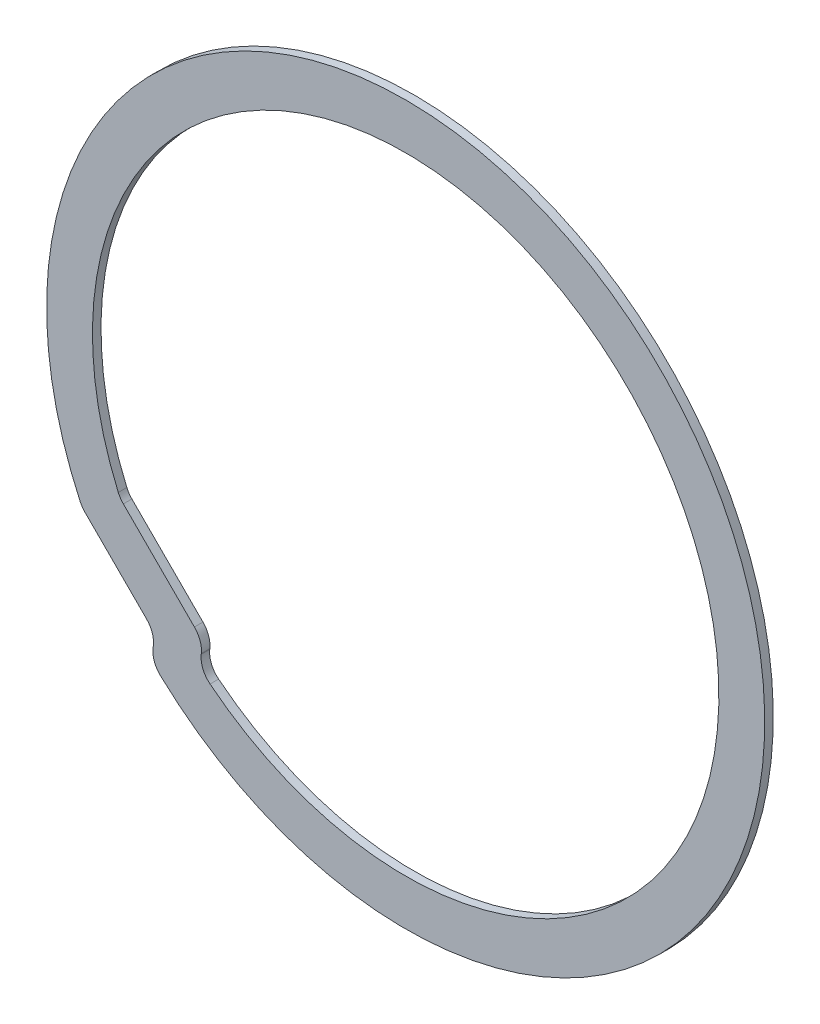
ISO-10303-21;
HEADER;
FILE_DESCRIPTION(('STEP AP214'),'2;1');
FILE_NAME('part.step','',(''),(''),'','','');
FILE_SCHEMA(('AUTOMOTIVE_DESIGN { 1 0 10303 214 1 1 1 1 }'));
ENDSEC;
DATA;
#1=APPLICATION_CONTEXT('core data for automotive mechanical design processes');
#2=APPLICATION_PROTOCOL_DEFINITION('international standard','automotive_design',2000,#1);
#3=PRODUCT_CONTEXT('',#1,'mechanical');
#4=PRODUCT('Part','Part','',(#3));
#5=PRODUCT_RELATED_PRODUCT_CATEGORY('part','',(#4));
#6=PRODUCT_DEFINITION_FORMATION('','',#4);
#7=PRODUCT_DEFINITION_CONTEXT('part definition',#1,'design');
#8=PRODUCT_DEFINITION('design','',#6,#7);
#9=PRODUCT_DEFINITION_SHAPE('','',#8);
#10=(LENGTH_UNIT() NAMED_UNIT(*) SI_UNIT(.MILLI.,.METRE.));
#11=(NAMED_UNIT(*) PLANE_ANGLE_UNIT() SI_UNIT($,.RADIAN.));
#12=(NAMED_UNIT(*) SI_UNIT($,.STERADIAN.) SOLID_ANGLE_UNIT());
#13=UNCERTAINTY_MEASURE_WITH_UNIT(LENGTH_MEASURE(1.E-05),#10,'distance_accuracy_value','');
#14=(GEOMETRIC_REPRESENTATION_CONTEXT(3) GLOBAL_UNCERTAINTY_ASSIGNED_CONTEXT((#13)) GLOBAL_UNIT_ASSIGNED_CONTEXT((#10,
#11,#12)) REPRESENTATION_CONTEXT('',''));
#15=CARTESIAN_POINT('',(0.,0.,0.));
#16=DIRECTION('',(0.,0.,1.));
#17=DIRECTION('',(1.,0.,0.));
#18=AXIS2_PLACEMENT_3D('',#15,#16,#17);
#19=CARTESIAN_POINT('',(-93.247183919653,-61.2132213627366,1.5875));
#20=DIRECTION('',(0.99410299247217,-0.108440031159511,0.));
#21=DIRECTION('',(0.108440031159511,0.99410299247217,0.));
#22=AXIS2_PLACEMENT_3D('',#19,#20,#21);
#23=PLANE('',#22);
#24=DIRECTION('',(-0.108440031159511,-0.99410299247217,0.));
#25=VECTOR('',#24,1.);
#26=CARTESIAN_POINT('',(-93.247183919653,-61.2132213627366,-1.5875));
#27=LINE('',#26,#25);
#28=CARTESIAN_POINT('',(-93.7093333479408,-65.4498867778762,-1.5875));
#29=VERTEX_POINT('',#28);
#30=CARTESIAN_POINT('',(-93.8206577530743,-66.4704317103622,-1.5875));
#31=VERTEX_POINT('',#30);
#32=EDGE_CURVE('E218',#29,#31,#27,.T.);
#33=ORIENTED_EDGE('',*,*,#32,.T.);
#34=DIRECTION('',(0.,0.,-1.));
#35=VECTOR('',#34,1.);
#36=CARTESIAN_POINT('',(-93.8206577530743,-66.4704317103622,1.5875));
#37=LINE('',#36,#35);
#38=CARTESIAN_POINT('',(-93.8206577530743,-66.4704317103622,1.5875));
#39=VERTEX_POINT('',#38);
#40=EDGE_CURVE('E52',#31,#39,#37,.F.);
#41=ORIENTED_EDGE('',*,*,#40,.T.);
#42=DIRECTION('',(-0.108440031159511,-0.99410299247217,0.));
#43=VECTOR('',#42,1.);
#44=CARTESIAN_POINT('',(-93.247183919653,-61.2132213627366,1.5875));
#45=LINE('',#44,#43);
#46=CARTESIAN_POINT('',(-93.7093333479408,-65.4498867778762,1.5875));
#47=VERTEX_POINT('',#46);
#48=EDGE_CURVE('E219',#47,#39,#45,.T.);
#49=ORIENTED_EDGE('',*,*,#48,.F.);
#50=DIRECTION('',(0.,0.,-1.));
#51=VECTOR('',#50,1.);
#52=CARTESIAN_POINT('',(-93.7093333479408,-65.4498867778762,-1.5875));
#53=LINE('',#52,#51);
#54=EDGE_CURVE('E179',#47,#29,#53,.T.);
#55=ORIENTED_EDGE('',*,*,#54,.T.);
#56=EDGE_LOOP('',(#33,#41,#49,#55));
#57=FACE_BOUND('',#56,.T.);
#58=ADVANCED_FACE('F37',(#57),#23,.F.);
#59=CARTESIAN_POINT('',(0.,23.495,1.5875));
#60=DIRECTION('',(0.,0.,-1.));
#61=DIRECTION('',(-1.,0.,0.));
#62=AXIS2_PLACEMENT_3D('',#59,#60,#61);
#63=CYLINDRICAL_SURFACE('',#62,133.35);
#64=CARTESIAN_POINT('',(0.,23.495,-1.5875));
#65=DIRECTION('',(0.,0.,1.));
#66=DIRECTION('',(1.,0.,0.));
#67=AXIS2_PLACEMENT_3D('',#64,#65,#66);
#68=CIRCLE('',#67,133.35);
#69=CARTESIAN_POINT('',(-91.0533023035679,-73.9294252721825,-1.5875));
#70=VERTEX_POINT('',#69);
#71=CARTESIAN_POINT('',(-120.870260590929,-32.8308608871707,-1.5875));
#72=VERTEX_POINT('',#71);
#73=EDGE_CURVE('E227',#70,#72,#68,.T.);
#74=ORIENTED_EDGE('',*,*,#73,.T.);
#75=DIRECTION('',(0.,0.,-1.));
#76=VECTOR('',#75,1.);
#77=CARTESIAN_POINT('',(-120.870260590929,-32.8308608871707,1.5875));
#78=LINE('',#77,#76);
#79=CARTESIAN_POINT('',(-120.870260590929,-32.8308608871707,1.5875));
#80=VERTEX_POINT('',#79);
#81=EDGE_CURVE('E171',#72,#80,#78,.F.);
#82=ORIENTED_EDGE('',*,*,#81,.T.);
#83=CARTESIAN_POINT('',(0.,23.495,1.5875));
#84=DIRECTION('',(0.,0.,1.));
#85=DIRECTION('',(1.,0.,0.));
#86=AXIS2_PLACEMENT_3D('',#83,#84,#85);
#87=CIRCLE('',#86,133.35);
#88=CARTESIAN_POINT('',(-91.0533023035679,-73.9294252721825,1.5875));
#89=VERTEX_POINT('',#88);
#90=EDGE_CURVE('E221',#89,#80,#87,.T.);
#91=ORIENTED_EDGE('',*,*,#90,.F.);
#92=DIRECTION('',(0.,0.,-1.));
#93=VECTOR('',#92,1.);
#94=CARTESIAN_POINT('',(-91.0533023035679,-73.9294252721825,1.5875));
#95=LINE('',#94,#93);
#96=EDGE_CURVE('E168',#89,#70,#95,.T.);
#97=ORIENTED_EDGE('',*,*,#96,.T.);
#98=EDGE_LOOP('',(#74,#82,#91,#97));
#99=FACE_BOUND('',#98,.T.);
#100=ADVANCED_FACE('F252',(#99),#63,.T.);
#101=CARTESIAN_POINT('',(-120.187952282861,-34.2724529995294,1.5875));
#102=DIRECTION('',(0.707106781186544,0.707106781186551,0.));
#103=DIRECTION('',(-0.707106781186551,0.707106781186544,0.));
#104=AXIS2_PLACEMENT_3D('',#101,#102,#103);
#105=PLANE('',#104);
#106=DIRECTION('',(0.707106781186551,-0.707106781186544,0.));
#107=VECTOR('',#106,1.);
#108=CARTESIAN_POINT('',(-120.187952282861,-34.2724529995294,1.5875));
#109=LINE('',#108,#107);
#110=CARTESIAN_POINT('',(-119.098422502949,-35.3619827794411,1.5875));
#111=VERTEX_POINT('',#110);
#112=CARTESIAN_POINT('',(-96.26072966627,-58.1996756161197,1.5875));
#113=VERTEX_POINT('',#112);
#114=EDGE_CURVE('E139',#111,#113,#109,.T.);
#115=ORIENTED_EDGE('',*,*,#114,.F.);
#116=DIRECTION('',(0.,0.,-1.));
#117=VECTOR('',#116,1.);
#118=CARTESIAN_POINT('',(-119.098422502949,-35.3619827794411,1.5875));
#119=LINE('',#118,#117);
#120=CARTESIAN_POINT('',(-119.098422502949,-35.3619827794411,-1.5875));
#121=VERTEX_POINT('',#120);
#122=EDGE_CURVE('E158',#111,#121,#119,.T.);
#123=ORIENTED_EDGE('',*,*,#122,.T.);
#124=DIRECTION('',(0.707106781186551,-0.707106781186544,0.));
#125=VECTOR('',#124,1.);
#126=CARTESIAN_POINT('',(-120.187952282861,-34.2724529995294,-1.5875));
#127=LINE('',#126,#125);
#128=CARTESIAN_POINT('',(-96.26072966627,-58.1996756161197,-1.5875));
#129=VERTEX_POINT('',#128);
#130=EDGE_CURVE('E222',#121,#129,#127,.T.);
#131=ORIENTED_EDGE('',*,*,#130,.T.);
#132=DIRECTION('',(0.,0.,-1.));
#133=VECTOR('',#132,1.);
#134=CARTESIAN_POINT('',(-96.26072966627,-58.1996756161197,1.5875));
#135=LINE('',#134,#133);
#136=EDGE_CURVE('E163',#129,#113,#135,.F.);
#137=ORIENTED_EDGE('',*,*,#136,.T.);
#138=EDGE_LOOP('',(#115,#123,#131,#137));
#139=FACE_BOUND('',#138,.T.);
#140=ADVANCED_FACE('F237',(#139),#105,.F.);
#141=CARTESIAN_POINT('',(0.,23.495,1.5875));
#142=DIRECTION('',(0.,0.,1.));
#143=DIRECTION('',(1.,0.,0.));
#144=AXIS2_PLACEMENT_3D('',#141,#142,#143);
#145=PLANE('',#144);
#146=DIRECTION('',(-0.108440031159515,-0.99410299247217,0.));
#147=VECTOR('',#146,1.);
#148=CARTESIAN_POINT('',(-75.444853145325,-54.9484657325992,1.5875));
#149=LINE('',#148,#147);
#150=CARTESIAN_POINT('',(-75.9070025736128,-59.1851311477388,1.5875));
#151=VERTEX_POINT('',#150);
#152=CARTESIAN_POINT('',(-75.9364173903969,-59.4547857861175,1.5875));
#153=VERTEX_POINT('',#152);
#154=EDGE_CURVE('E196',#151,#153,#149,.T.);
#155=ORIENTED_EDGE('',*,*,#154,.F.);
#156=CARTESIAN_POINT('',(-84.7445781766904,-58.2210992707307,1.58750000000002));
#157=DIRECTION('',(0.,0.,1.));
#158=DIRECTION('',(1.,0.,0.));
#159=AXIS2_PLACEMENT_3D('',#156,#157,#158);
#160=CIRCLE('',#159,8.89);
#161=CARTESIAN_POINT('',(-78.458398891942,-51.9349199859823,1.5875));
#162=VERTEX_POINT('',#161);
#163=EDGE_CURVE('E173',#151,#162,#160,.T.);
#164=ORIENTED_EDGE('',*,*,#163,.T.);
#165=DIRECTION('',(0.707106781186551,-0.707106781186544,0.));
#166=VECTOR('',#165,1.);
#167=CARTESIAN_POINT('',(-106.033048043231,-24.3602708346936,1.5875));
#168=LINE('',#167,#166);
#169=CARTESIAN_POINT('',(-104.860848399631,-25.5324704782937,1.5875));
#170=VERTEX_POINT('',#169);
#171=EDGE_CURVE('E135',#170,#162,#168,.T.);
#172=ORIENTED_EDGE('',*,*,#171,.F.);
#173=CARTESIAN_POINT('',(-98.5746691148825,-19.2462911935452,1.58750000000002));
#174=DIRECTION('',(0.,0.,1.));
#175=DIRECTION('',(1.,0.,0.));
#176=AXIS2_PLACEMENT_3D('',#173,#174,#175);
#177=CIRCLE('',#176,8.89);
#178=CARTESIAN_POINT('',(-106.73096561375,-22.7828046492759,1.5875));
#179=VERTEX_POINT('',#178);
#180=EDGE_CURVE('E186',#170,#179,#177,.F.);
#181=ORIENTED_EDGE('',*,*,#180,.T.);
#182=CARTESIAN_POINT('',(0.,23.495,1.5875));
#183=DIRECTION('',(0.,0.,1.));
#184=DIRECTION('',(1.,0.,0.));
#185=AXIS2_PLACEMENT_3D('',#182,#183,#184);
#186=CIRCLE('',#185,116.332);
#187=CARTESIAN_POINT('',(-72.6507554103836,-67.3620413468357,1.5875));
#188=VERTEX_POINT('',#187);
#189=EDGE_CURVE('E198',#188,#179,#186,.T.);
#190=ORIENTED_EDGE('',*,*,#189,.F.);
#191=CARTESIAN_POINT('',(-67.0988417873193,-60.4188176631255,1.58750000000002));
#192=DIRECTION('',(0.,0.,1.));
#193=DIRECTION('',(1.,0.,0.));
#194=AXIS2_PLACEMENT_3D('',#191,#192,#193);
#195=CIRCLE('',#194,8.89);
#196=EDGE_CURVE('E45',#188,#153,#195,.F.);
#197=ORIENTED_EDGE('',*,*,#196,.T.);
#198=EDGE_LOOP('',(#155,#164,#172,#181,#190,#197));
#199=FACE_BOUND('',#198,.T.);
#200=ORIENTED_EDGE('',*,*,#90,.T.);
#201=CARTESIAN_POINT('',(-112.8122432182,-29.0758034946927,1.5875));
#202=DIRECTION('',(0.,0.,1.));
#203=DIRECTION('',(1.,0.,0.));
#204=AXIS2_PLACEMENT_3D('',#201,#202,#203);
#205=CIRCLE('',#204,8.89);
#206=EDGE_CURVE('E177',#80,#111,#205,.T.);
#207=ORIENTED_EDGE('',*,*,#206,.T.);
#208=ORIENTED_EDGE('',*,*,#114,.T.);
#209=CARTESIAN_POINT('',(-102.546908951018,-64.4858549008681,1.5875));
#210=DIRECTION('',(0.,0.,1.));
#211=DIRECTION('',(1.,0.,0.));
#212=AXIS2_PLACEMENT_3D('',#209,#210,#211);
#213=CIRCLE('',#212,8.89);
#214=EDGE_CURVE('E59',#113,#47,#213,.F.);
#215=ORIENTED_EDGE('',*,*,#214,.T.);
#216=ORIENTED_EDGE('',*,*,#48,.T.);
#217=CARTESIAN_POINT('',(-84.9830821499967,-67.4344635873703,1.5875));
#218=DIRECTION('',(0.,0.,1.));
#219=DIRECTION('',(1.,0.,0.));
#220=AXIS2_PLACEMENT_3D('',#217,#218,#219);
#221=CIRCLE('',#220,8.89);
#222=EDGE_CURVE('E175',#39,#89,#221,.T.);
#223=ORIENTED_EDGE('',*,*,#222,.T.);
#224=EDGE_LOOP('',(#200,#207,#208,#215,#216,#223));
#225=FACE_BOUND('',#224,.T.);
#226=ADVANCED_FACE('F195',(#199,#225),#145,.T.);
#227=CARTESIAN_POINT('',(0.,23.495,-1.5875));
#228=DIRECTION('',(0.,0.,1.));
#229=DIRECTION('',(1.,0.,0.));
#230=AXIS2_PLACEMENT_3D('',#227,#228,#229);
#231=PLANE('',#230);
#232=DIRECTION('',(-0.707106781186551,0.707106781186544,0.));
#233=VECTOR('',#232,1.);
#234=CARTESIAN_POINT('',(-106.033048043231,-24.3602708346936,-1.58750000000002));
#235=LINE('',#234,#233);
#236=CARTESIAN_POINT('',(-78.458398891942,-51.9349199859823,-1.58750000000002));
#237=VERTEX_POINT('',#236);
#238=CARTESIAN_POINT('',(-104.860848399631,-25.5324704782937,-1.58750000000002));
#239=VERTEX_POINT('',#238);
#240=EDGE_CURVE('E132',#237,#239,#235,.T.);
#241=ORIENTED_EDGE('',*,*,#240,.F.);
#242=CARTESIAN_POINT('',(-84.7445781766904,-58.2210992707307,-1.58750000000002));
#243=DIRECTION('',(0.,0.,1.));
#244=DIRECTION('',(1.,0.,0.));
#245=AXIS2_PLACEMENT_3D('',#242,#243,#244);
#246=CIRCLE('',#245,8.89);
#247=CARTESIAN_POINT('',(-75.9070025736128,-59.1851311477388,-1.58750000000002));
#248=VERTEX_POINT('',#247);
#249=EDGE_CURVE('E145',#237,#248,#246,.F.);
#250=ORIENTED_EDGE('',*,*,#249,.T.);
#251=DIRECTION('',(0.108440031159515,0.99410299247217,0.));
#252=VECTOR('',#251,1.);
#253=CARTESIAN_POINT('',(-75.444853145325,-54.9484657325992,-1.58750000000002));
#254=LINE('',#253,#252);
#255=CARTESIAN_POINT('',(-75.9364173903969,-59.4547857861175,-1.58750000000002));
#256=VERTEX_POINT('',#255);
#257=EDGE_CURVE('E150',#256,#248,#254,.T.);
#258=ORIENTED_EDGE('',*,*,#257,.F.);
#259=CARTESIAN_POINT('',(-67.0988417873193,-60.4188176631255,-1.58750000000002));
#260=DIRECTION('',(0.,0.,1.));
#261=DIRECTION('',(1.,0.,0.));
#262=AXIS2_PLACEMENT_3D('',#259,#260,#261);
#263=CIRCLE('',#262,8.89);
#264=CARTESIAN_POINT('',(-72.6507554103836,-67.3620413468357,-1.58750000000002));
#265=VERTEX_POINT('',#264);
#266=EDGE_CURVE('E11',#256,#265,#263,.T.);
#267=ORIENTED_EDGE('',*,*,#266,.T.);
#268=CARTESIAN_POINT('',(0.,23.495,-1.58750000000002));
#269=DIRECTION('',(0.,0.,1.));
#270=DIRECTION('',(1.,0.,0.));
#271=AXIS2_PLACEMENT_3D('',#268,#269,#270);
#272=CIRCLE('',#271,116.332);
#273=CARTESIAN_POINT('',(-106.73096561375,-22.7828046492759,-1.58750000000002));
#274=VERTEX_POINT('',#273);
#275=EDGE_CURVE('E151',#274,#265,#272,.F.);
#276=ORIENTED_EDGE('',*,*,#275,.F.);
#277=CARTESIAN_POINT('',(-98.5746691148825,-19.2462911935452,-1.58750000000002));
#278=DIRECTION('',(0.,0.,1.));
#279=DIRECTION('',(1.,0.,0.));
#280=AXIS2_PLACEMENT_3D('',#277,#278,#279);
#281=CIRCLE('',#280,8.89);
#282=EDGE_CURVE('E149',#274,#239,#281,.T.);
#283=ORIENTED_EDGE('',*,*,#282,.T.);
#284=EDGE_LOOP('',(#241,#250,#258,#267,#276,#283));
#285=FACE_BOUND('',#284,.T.);
#286=ORIENTED_EDGE('',*,*,#130,.F.);
#287=CARTESIAN_POINT('',(-112.8122432182,-29.0758034946927,-1.5875));
#288=DIRECTION('',(0.,0.,1.));
#289=DIRECTION('',(1.,0.,0.));
#290=AXIS2_PLACEMENT_3D('',#287,#288,#289);
#291=CIRCLE('',#290,8.89);
#292=EDGE_CURVE('E160',#121,#72,#291,.F.);
#293=ORIENTED_EDGE('',*,*,#292,.T.);
#294=ORIENTED_EDGE('',*,*,#73,.F.);
#295=CARTESIAN_POINT('',(-84.9830821499967,-67.4344635873703,-1.5875));
#296=DIRECTION('',(0.,0.,1.));
#297=DIRECTION('',(1.,0.,0.));
#298=AXIS2_PLACEMENT_3D('',#295,#296,#297);
#299=CIRCLE('',#298,8.89);
#300=EDGE_CURVE('E157',#70,#31,#299,.F.);
#301=ORIENTED_EDGE('',*,*,#300,.T.);
#302=ORIENTED_EDGE('',*,*,#32,.F.);
#303=CARTESIAN_POINT('',(-102.546908951018,-64.4858549008681,-1.5875));
#304=DIRECTION('',(0.,0.,1.));
#305=DIRECTION('',(1.,0.,0.));
#306=AXIS2_PLACEMENT_3D('',#303,#304,#305);
#307=CIRCLE('',#306,8.89);
#308=EDGE_CURVE('E189',#29,#129,#307,.T.);
#309=ORIENTED_EDGE('',*,*,#308,.T.);
#310=EDGE_LOOP('',(#286,#293,#294,#301,#302,#309));
#311=FACE_BOUND('',#310,.T.);
#312=ADVANCED_FACE('F142',(#285,#311),#231,.F.);
#313=CARTESIAN_POINT('',(-106.033048043231,-24.3602708346936,-330.624084275974));
#314=DIRECTION('',(-0.707106781186544,-0.707106781186551,0.));
#315=DIRECTION('',(0.707106781186551,-0.707106781186544,0.));
#316=AXIS2_PLACEMENT_3D('',#313,#314,#315);
#317=PLANE('',#316);
#318=ORIENTED_EDGE('',*,*,#240,.T.);
#319=DIRECTION('',(0.,0.,-1.));
#320=VECTOR('',#319,1.);
#321=CARTESIAN_POINT('',(-104.860848399631,-25.5324704782937,1.58750000000002));
#322=LINE('',#321,#320);
#323=EDGE_CURVE('E138',#239,#170,#322,.F.);
#324=ORIENTED_EDGE('',*,*,#323,.T.);
#325=ORIENTED_EDGE('',*,*,#171,.T.);
#326=DIRECTION('',(0.,0.,1.));
#327=VECTOR('',#326,1.);
#328=CARTESIAN_POINT('',(-78.458398891942,-51.9349199859823,-330.624084275974));
#329=LINE('',#328,#327);
#330=EDGE_CURVE('E128',#162,#237,#329,.F.);
#331=ORIENTED_EDGE('',*,*,#330,.T.);
#332=EDGE_LOOP('',(#318,#324,#325,#331));
#333=FACE_BOUND('',#332,.T.);
#334=ADVANCED_FACE('F130',(#333),#317,.F.);
#335=CARTESIAN_POINT('',(0.,23.495,-330.624084275974));
#336=DIRECTION('',(0.,0.,1.));
#337=DIRECTION('',(1.,0.,0.));
#338=AXIS2_PLACEMENT_3D('',#335,#336,#337);
#339=CYLINDRICAL_SURFACE('',#338,116.332);
#340=ORIENTED_EDGE('',*,*,#189,.T.);
#341=DIRECTION('',(0.,0.,1.));
#342=VECTOR('',#341,1.);
#343=CARTESIAN_POINT('',(-106.73096561375,-22.7828046492759,-330.624084275974));
#344=LINE('',#343,#342);
#345=EDGE_CURVE('E212',#179,#274,#344,.F.);
#346=ORIENTED_EDGE('',*,*,#345,.T.);
#347=ORIENTED_EDGE('',*,*,#275,.T.);
#348=DIRECTION('',(0.,0.,1.));
#349=VECTOR('',#348,1.);
#350=CARTESIAN_POINT('',(-72.6507554103836,-67.3620413468357,-330.624084275974));
#351=LINE('',#350,#349);
#352=EDGE_CURVE('E207',#265,#188,#351,.T.);
#353=ORIENTED_EDGE('',*,*,#352,.T.);
#354=EDGE_LOOP('',(#340,#346,#347,#353));
#355=FACE_BOUND('',#354,.T.);
#356=ADVANCED_FACE('F210',(#355),#339,.F.);
#357=CARTESIAN_POINT('',(-75.444853145325,-54.9484657325992,-330.624084275974));
#358=DIRECTION('',(-0.99410299247217,0.108440031159515,0.));
#359=DIRECTION('',(-0.108440031159515,-0.99410299247217,0.));
#360=AXIS2_PLACEMENT_3D('',#357,#358,#359);
#361=PLANE('',#360);
#362=ORIENTED_EDGE('',*,*,#257,.T.);
#363=DIRECTION('',(0.,0.,1.));
#364=VECTOR('',#363,1.);
#365=CARTESIAN_POINT('',(-75.9070025736128,-59.1851311477388,-330.624084275974));
#366=LINE('',#365,#364);
#367=EDGE_CURVE('E156',#248,#151,#366,.T.);
#368=ORIENTED_EDGE('',*,*,#367,.T.);
#369=ORIENTED_EDGE('',*,*,#154,.T.);
#370=DIRECTION('',(0.,0.,-1.));
#371=VECTOR('',#370,1.);
#372=CARTESIAN_POINT('',(-75.9364173903969,-59.4547857861175,-1.58750000000002));
#373=LINE('',#372,#371);
#374=EDGE_CURVE('E183',#153,#256,#373,.T.);
#375=ORIENTED_EDGE('',*,*,#374,.T.);
#376=EDGE_LOOP('',(#362,#368,#369,#375));
#377=FACE_BOUND('',#376,.T.);
#378=ADVANCED_FACE('F204',(#377),#361,.F.);
#379=CARTESIAN_POINT('',(-98.5746691148825,-19.2462911935452,-330.624084275974));
#380=DIRECTION('',(0.,0.,1.));
#381=DIRECTION('',(1.,0.,0.));
#382=AXIS2_PLACEMENT_3D('',#379,#380,#381);
#383=CYLINDRICAL_SURFACE('',#382,8.89);
#384=ORIENTED_EDGE('',*,*,#282,.F.);
#385=ORIENTED_EDGE('',*,*,#345,.F.);
#386=ORIENTED_EDGE('',*,*,#180,.F.);
#387=ORIENTED_EDGE('',*,*,#323,.F.);
#388=EDGE_LOOP('',(#384,#385,#386,#387));
#389=FACE_BOUND('',#388,.T.);
#390=ADVANCED_FACE('F257',(#389),#383,.F.);
#391=CARTESIAN_POINT('',(-112.8122432182,-29.0758034946927,1.5875));
#392=DIRECTION('',(0.,0.,-1.));
#393=DIRECTION('',(-1.,0.,0.));
#394=AXIS2_PLACEMENT_3D('',#391,#392,#393);
#395=CYLINDRICAL_SURFACE('',#394,8.89);
#396=ORIENTED_EDGE('',*,*,#206,.F.);
#397=ORIENTED_EDGE('',*,*,#81,.F.);
#398=ORIENTED_EDGE('',*,*,#292,.F.);
#399=ORIENTED_EDGE('',*,*,#122,.F.);
#400=EDGE_LOOP('',(#396,#397,#398,#399));
#401=FACE_BOUND('',#400,.T.);
#402=ADVANCED_FACE('F255',(#401),#395,.T.);
#403=CARTESIAN_POINT('',(-84.9830821499967,-67.4344635873703,1.5875));
#404=DIRECTION('',(0.,0.,-1.));
#405=DIRECTION('',(-1.,0.,0.));
#406=AXIS2_PLACEMENT_3D('',#403,#404,#405);
#407=CYLINDRICAL_SURFACE('',#406,8.89);
#408=ORIENTED_EDGE('',*,*,#222,.F.);
#409=ORIENTED_EDGE('',*,*,#40,.F.);
#410=ORIENTED_EDGE('',*,*,#300,.F.);
#411=ORIENTED_EDGE('',*,*,#96,.F.);
#412=EDGE_LOOP('',(#408,#409,#410,#411));
#413=FACE_BOUND('',#412,.T.);
#414=ADVANCED_FACE('F249',(#413),#407,.T.);
#415=CARTESIAN_POINT('',(-102.546908951018,-64.4858549008681,1.5875));
#416=DIRECTION('',(0.,0.,1.));
#417=DIRECTION('',(1.,0.,0.));
#418=AXIS2_PLACEMENT_3D('',#415,#416,#417);
#419=CYLINDRICAL_SURFACE('',#418,8.89);
#420=ORIENTED_EDGE('',*,*,#214,.F.);
#421=ORIENTED_EDGE('',*,*,#136,.F.);
#422=ORIENTED_EDGE('',*,*,#308,.F.);
#423=ORIENTED_EDGE('',*,*,#54,.F.);
#424=EDGE_LOOP('',(#420,#421,#422,#423));
#425=FACE_BOUND('',#424,.T.);
#426=ADVANCED_FACE('F243',(#425),#419,.F.);
#427=CARTESIAN_POINT('',(-84.7445781766904,-58.2210992707307,-330.624084275974));
#428=DIRECTION('',(0.,0.,1.));
#429=DIRECTION('',(1.,0.,0.));
#430=AXIS2_PLACEMENT_3D('',#427,#428,#429);
#431=CYLINDRICAL_SURFACE('',#430,8.89);
#432=ORIENTED_EDGE('',*,*,#249,.F.);
#433=ORIENTED_EDGE('',*,*,#330,.F.);
#434=ORIENTED_EDGE('',*,*,#163,.F.);
#435=ORIENTED_EDGE('',*,*,#367,.F.);
#436=EDGE_LOOP('',(#432,#433,#434,#435));
#437=FACE_BOUND('',#436,.T.);
#438=ADVANCED_FACE('F154',(#437),#431,.T.);
#439=CARTESIAN_POINT('',(-67.0988417873193,-60.4188176631255,-330.624084275974));
#440=DIRECTION('',(0.,0.,1.));
#441=DIRECTION('',(1.,0.,0.));
#442=AXIS2_PLACEMENT_3D('',#439,#440,#441);
#443=CYLINDRICAL_SURFACE('',#442,8.89);
#444=ORIENTED_EDGE('',*,*,#266,.F.);
#445=ORIENTED_EDGE('',*,*,#374,.F.);
#446=ORIENTED_EDGE('',*,*,#196,.F.);
#447=ORIENTED_EDGE('',*,*,#352,.F.);
#448=EDGE_LOOP('',(#444,#445,#446,#447));
#449=FACE_BOUND('',#448,.T.);
#450=ADVANCED_FACE('F39',(#449),#443,.F.);
#451=CLOSED_SHELL('',(#58,#100,#140,#226,#312,#334,#356,#378,#390,#402,#414,#426,#438,#450));
#452=MANIFOLD_SOLID_BREP('B2',#451);
#453=ADVANCED_BREP_SHAPE_REPRESENTATION('',(#18,#452),#14);
#454=SHAPE_DEFINITION_REPRESENTATION(#9,#453);
ENDSEC;
END-ISO-10303-21;
